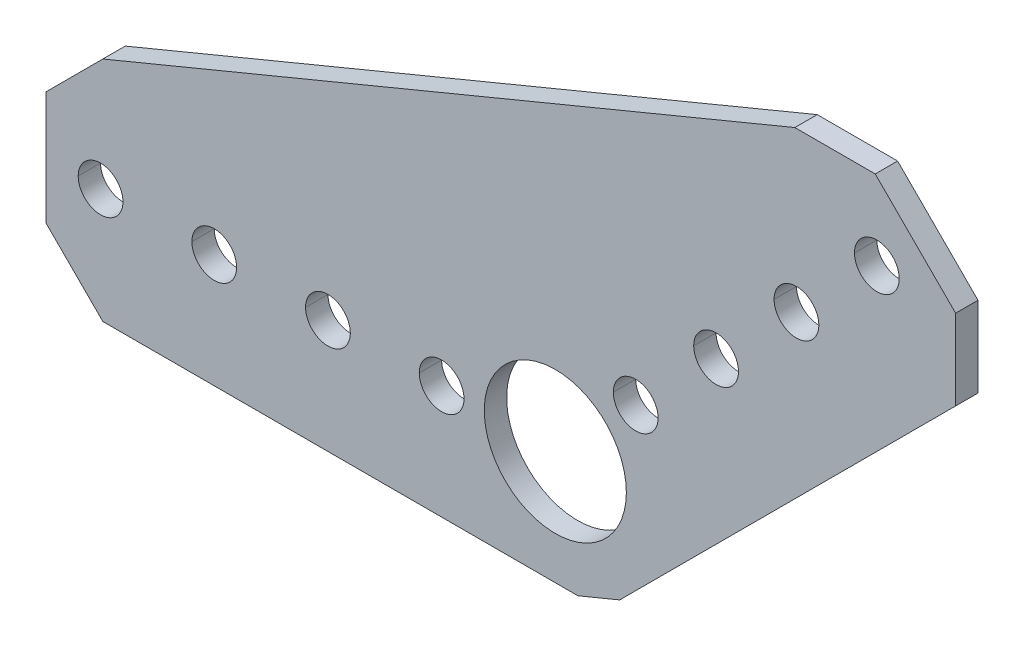
ISO-10303-21;
HEADER;
FILE_DESCRIPTION(('STEP AP214'),'2;1');
FILE_NAME('part.step','',(''),(''),'','','');
FILE_SCHEMA(('AUTOMOTIVE_DESIGN { 1 0 10303 214 1 1 1 1 }'));
ENDSEC;
DATA;
#1=APPLICATION_CONTEXT('core data for automotive mechanical design processes');
#2=APPLICATION_PROTOCOL_DEFINITION('international standard','automotive_design',2000,#1);
#3=PRODUCT_CONTEXT('',#1,'mechanical');
#4=PRODUCT('Part','Part','',(#3));
#5=PRODUCT_RELATED_PRODUCT_CATEGORY('part','',(#4));
#6=PRODUCT_DEFINITION_FORMATION('','',#4);
#7=PRODUCT_DEFINITION_CONTEXT('part definition',#1,'design');
#8=PRODUCT_DEFINITION('design','',#6,#7);
#9=PRODUCT_DEFINITION_SHAPE('','',#8);
#10=(LENGTH_UNIT() NAMED_UNIT(*) SI_UNIT(.MILLI.,.METRE.));
#11=(NAMED_UNIT(*) PLANE_ANGLE_UNIT() SI_UNIT($,.RADIAN.));
#12=(NAMED_UNIT(*) SI_UNIT($,.STERADIAN.) SOLID_ANGLE_UNIT());
#13=UNCERTAINTY_MEASURE_WITH_UNIT(LENGTH_MEASURE(1.E-05),#10,'distance_accuracy_value','');
#14=(GEOMETRIC_REPRESENTATION_CONTEXT(3) GLOBAL_UNCERTAINTY_ASSIGNED_CONTEXT((#13)) GLOBAL_UNIT_ASSIGNED_CONTEXT((#10,
#11,#12)) REPRESENTATION_CONTEXT('',''));
#15=CARTESIAN_POINT('',(0.,0.,0.));
#16=DIRECTION('',(0.,0.,1.));
#17=DIRECTION('',(1.,0.,0.));
#18=AXIS2_PLACEMENT_3D('',#15,#16,#17);
#19=CARTESIAN_POINT('',(-50.546,12.7,-84.9266705185577));
#20=DIRECTION('',(-0.382683432365091,0.923879532511286,0.));
#21=DIRECTION('',(0.,0.,1.));
#22=AXIS2_PLACEMENT_3D('',#19,#20,#21);
#23=PLANE('',#22);
#24=DIRECTION('',(0.923879532511286,0.382683432365091,0.));
#25=VECTOR('',#24,1.);
#26=CARTESIAN_POINT('',(-50.546,12.7,-1.25));
#27=LINE('',#26,#25);
#28=CARTESIAN_POINT('',(-50.546,12.7,-1.25));
#29=VERTEX_POINT('',#28);
#30=CARTESIAN_POINT('',(26.7611632407861,44.7216754829245,-1.25));
#31=VERTEX_POINT('',#30);
#32=EDGE_CURVE('E126',#29,#31,#27,.T.);
#33=ORIENTED_EDGE('',*,*,#32,.F.);
#34=DIRECTION('',(0.,0.,1.));
#35=VECTOR('',#34,1.);
#36=CARTESIAN_POINT('',(-50.546,12.7,1.25));
#37=LINE('',#36,#35);
#38=CARTESIAN_POINT('',(-50.546,12.7,1.25));
#39=VERTEX_POINT('',#38);
#40=EDGE_CURVE('E65',#29,#39,#37,.T.);
#41=ORIENTED_EDGE('',*,*,#40,.T.);
#42=DIRECTION('',(-0.923879532511286,-0.382683432365091,0.));
#43=VECTOR('',#42,1.);
#44=CARTESIAN_POINT('',(-50.546,12.7,1.25));
#45=LINE('',#44,#43);
#46=CARTESIAN_POINT('',(26.7611632407861,44.7216754829245,1.25));
#47=VERTEX_POINT('',#46);
#48=EDGE_CURVE('E123',#47,#39,#45,.T.);
#49=ORIENTED_EDGE('',*,*,#48,.F.);
#50=DIRECTION('',(0.,0.,-1.));
#51=VECTOR('',#50,1.);
#52=CARTESIAN_POINT('',(26.7611632407861,44.7216754829245,1.25));
#53=LINE('',#52,#51);
#54=EDGE_CURVE('E11',#47,#31,#53,.T.);
#55=ORIENTED_EDGE('',*,*,#54,.T.);
#56=EDGE_LOOP('',(#33,#41,#49,#55));
#57=FACE_BOUND('',#56,.T.);
#58=ADVANCED_FACE('F55',(#57),#23,.T.);
#59=CARTESIAN_POINT('',(44.7216754829243,35.7414193618553,1.25));
#60=DIRECTION('',(1.,0.,0.));
#61=DIRECTION('',(0.,1.,0.));
#62=AXIS2_PLACEMENT_3D('',#59,#60,#61);
#63=PLANE('',#62);
#64=DIRECTION('',(0.,1.,0.));
#65=VECTOR('',#64,1.);
#66=CARTESIAN_POINT('',(44.7216754829243,0.,1.25));
#67=LINE('',#66,#65);
#68=CARTESIAN_POINT('',(44.7216754829243,26.7611632407862,1.25));
#69=VERTEX_POINT('',#68);
#70=CARTESIAN_POINT('',(44.7216754829243,35.7414193618553,1.25));
#71=VERTEX_POINT('',#70);
#72=EDGE_CURVE('E182',#69,#71,#67,.T.);
#73=ORIENTED_EDGE('',*,*,#72,.F.);
#74=DIRECTION('',(0.,0.,1.));
#75=VECTOR('',#74,1.);
#76=CARTESIAN_POINT('',(44.7216754829243,26.7611632407862,1.25));
#77=LINE('',#76,#75);
#78=CARTESIAN_POINT('',(44.7216754829243,26.7611632407862,-1.25));
#79=VERTEX_POINT('',#78);
#80=EDGE_CURVE('E356',#79,#69,#77,.T.);
#81=ORIENTED_EDGE('',*,*,#80,.F.);
#82=DIRECTION('',(0.,-1.,0.));
#83=VECTOR('',#82,1.);
#84=CARTESIAN_POINT('',(44.7216754829243,35.7414193618553,-1.25));
#85=LINE('',#84,#83);
#86=CARTESIAN_POINT('',(44.7216754829243,35.7414193618553,-1.25));
#87=VERTEX_POINT('',#86);
#88=EDGE_CURVE('E195',#87,#79,#85,.T.);
#89=ORIENTED_EDGE('',*,*,#88,.F.);
#90=DIRECTION('',(0.,0.,-1.));
#91=VECTOR('',#90,1.);
#92=CARTESIAN_POINT('',(44.7216754829243,35.7414193618553,-1.25));
#93=LINE('',#92,#91);
#94=EDGE_CURVE('E166',#71,#87,#93,.T.);
#95=ORIENTED_EDGE('',*,*,#94,.F.);
#96=EDGE_LOOP('',(#73,#81,#89,#95));
#97=FACE_BOUND('',#96,.T.);
#98=ADVANCED_FACE('F529',(#97),#63,.T.);
#99=CARTESIAN_POINT('',(26.7611632407861,44.7216754829245,1.25));
#100=DIRECTION('',(0.,-1.,0.));
#101=DIRECTION('',(-1.,0.,0.));
#102=AXIS2_PLACEMENT_3D('',#99,#100,#101);
#103=PLANE('',#102);
#104=DIRECTION('',(-1.,0.,0.));
#105=VECTOR('',#104,1.);
#106=CARTESIAN_POINT('',(0.,44.7216754829245,1.25));
#107=LINE('',#106,#105);
#108=CARTESIAN_POINT('',(35.7414193618552,44.7216754829245,1.25));
#109=VERTEX_POINT('',#108);
#110=EDGE_CURVE('E147',#109,#47,#107,.T.);
#111=ORIENTED_EDGE('',*,*,#110,.F.);
#112=DIRECTION('',(0.,0.,1.));
#113=VECTOR('',#112,1.);
#114=CARTESIAN_POINT('',(35.7414193618552,44.7216754829245,1.25));
#115=LINE('',#114,#113);
#116=CARTESIAN_POINT('',(35.7414193618552,44.7216754829245,-1.25));
#117=VERTEX_POINT('',#116);
#118=EDGE_CURVE('E161',#117,#109,#115,.T.);
#119=ORIENTED_EDGE('',*,*,#118,.F.);
#120=DIRECTION('',(1.,0.,0.));
#121=VECTOR('',#120,1.);
#122=CARTESIAN_POINT('',(26.7611632407861,44.7216754829245,-1.25));
#123=LINE('',#122,#121);
#124=EDGE_CURVE('E192',#31,#117,#123,.T.);
#125=ORIENTED_EDGE('',*,*,#124,.F.);
#126=ORIENTED_EDGE('',*,*,#54,.F.);
#127=EDGE_LOOP('',(#111,#119,#125,#126));
#128=FACE_BOUND('',#127,.T.);
#129=ADVANCED_FACE('F534',(#128),#103,.F.);
#130=CARTESIAN_POINT('',(-56.896,6.35,1.25));
#131=DIRECTION('',(0.707106781186546,-0.707106781186549,0.));
#132=DIRECTION('',(0.,0.,-1.));
#133=AXIS2_PLACEMENT_3D('',#130,#131,#132);
#134=PLANE('',#133);
#135=DIRECTION('',(-0.707106781186549,-0.707106781186546,0.));
#136=VECTOR('',#135,1.);
#137=CARTESIAN_POINT('',(-31.623,31.623,1.25));
#138=LINE('',#137,#136);
#139=CARTESIAN_POINT('',(-56.896,6.35,1.25));
#140=VERTEX_POINT('',#139);
#141=EDGE_CURVE('E135',#39,#140,#138,.T.);
#142=ORIENTED_EDGE('',*,*,#141,.F.);
#143=ORIENTED_EDGE('',*,*,#40,.F.);
#144=DIRECTION('',(0.707106781186549,0.707106781186546,0.));
#145=VECTOR('',#144,1.);
#146=CARTESIAN_POINT('',(-56.896,6.35,-1.25));
#147=LINE('',#146,#145);
#148=CARTESIAN_POINT('',(-56.896,6.35,-1.25));
#149=VERTEX_POINT('',#148);
#150=EDGE_CURVE('E187',#149,#29,#147,.T.);
#151=ORIENTED_EDGE('',*,*,#150,.F.);
#152=DIRECTION('',(0.,0.,-1.));
#153=VECTOR('',#152,1.);
#154=CARTESIAN_POINT('',(-56.896,6.35,1.25));
#155=LINE('',#154,#153);
#156=EDGE_CURVE('E138',#140,#149,#155,.T.);
#157=ORIENTED_EDGE('',*,*,#156,.F.);
#158=EDGE_LOOP('',(#142,#143,#151,#157));
#159=FACE_BOUND('',#158,.T.);
#160=ADVANCED_FACE('F136',(#159),#134,.F.);
#161=CARTESIAN_POINT('',(-50.546,-12.7,1.25));
#162=DIRECTION('',(-0.70710678118655,-0.707106781186545,0.));
#163=DIRECTION('',(-0.707106781186545,0.70710678118655,0.));
#164=AXIS2_PLACEMENT_3D('',#161,#162,#163);
#165=PLANE('',#164);
#166=DIRECTION('',(0.707106781186545,-0.70710678118655,0.));
#167=VECTOR('',#166,1.);
#168=CARTESIAN_POINT('',(-31.623,-31.623,1.25));
#169=LINE('',#168,#167);
#170=CARTESIAN_POINT('',(-56.896,-6.35,1.25));
#171=VERTEX_POINT('',#170);
#172=CARTESIAN_POINT('',(-50.546,-12.7,1.25));
#173=VERTEX_POINT('',#172);
#174=EDGE_CURVE('E143',#171,#173,#169,.T.);
#175=ORIENTED_EDGE('',*,*,#174,.F.);
#176=DIRECTION('',(0.,0.,1.));
#177=VECTOR('',#176,1.);
#178=CARTESIAN_POINT('',(-56.896,-6.35,1.25));
#179=LINE('',#178,#177);
#180=CARTESIAN_POINT('',(-56.896,-6.35,-1.25));
#181=VERTEX_POINT('',#180);
#182=EDGE_CURVE('E174',#181,#171,#179,.T.);
#183=ORIENTED_EDGE('',*,*,#182,.F.);
#184=DIRECTION('',(-0.707106781186545,0.70710678118655,0.));
#185=VECTOR('',#184,1.);
#186=CARTESIAN_POINT('',(-50.546,-12.7,-1.25));
#187=LINE('',#186,#185);
#188=CARTESIAN_POINT('',(-50.546,-12.7,-1.25));
#189=VERTEX_POINT('',#188);
#190=EDGE_CURVE('E191',#189,#181,#187,.T.);
#191=ORIENTED_EDGE('',*,*,#190,.F.);
#192=DIRECTION('',(0.,0.,-1.));
#193=VECTOR('',#192,1.);
#194=CARTESIAN_POINT('',(-50.546,-12.7,-1.25));
#195=LINE('',#194,#193);
#196=EDGE_CURVE('E335',#173,#189,#195,.T.);
#197=ORIENTED_EDGE('',*,*,#196,.F.);
#198=EDGE_LOOP('',(#175,#183,#191,#197));
#199=FACE_BOUND('',#198,.T.);
#200=ADVANCED_FACE('F545',(#199),#165,.T.);
#201=CARTESIAN_POINT('',(8.9802561210692,8.98025612106911,1.25));
#202=DIRECTION('',(0.,0.,1.));
#203=DIRECTION('',(1.,0.,0.));
#204=AXIS2_PLACEMENT_3D('',#201,#202,#203);
#205=CYLINDRICAL_SURFACE('',#204,2.5);
#206=DIRECTION('',(0.,0.,1.));
#207=VECTOR('',#206,1.);
#208=CARTESIAN_POINT('',(6.48025612106921,8.98025612106911,1.25));
#209=LINE('',#208,#207);
#210=CARTESIAN_POINT('',(6.4802561210692,8.98025612106911,-1.25));
#211=VERTEX_POINT('',#210);
#212=CARTESIAN_POINT('',(6.48025612106921,8.98025612106911,1.25));
#213=VERTEX_POINT('',#212);
#214=EDGE_CURVE('E445',#211,#213,#209,.T.);
#215=ORIENTED_EDGE('',*,*,#214,.F.);
#216=CARTESIAN_POINT('',(8.9802561210692,8.98025612106911,-1.25));
#217=DIRECTION('',(0.,0.,1.));
#218=DIRECTION('',(1.,0.,0.));
#219=AXIS2_PLACEMENT_3D('',#216,#217,#218);
#220=CIRCLE('',#219,2.5);
#221=CARTESIAN_POINT('',(11.4802561210692,8.98025612106911,-1.25));
#222=VERTEX_POINT('',#221);
#223=EDGE_CURVE('E190',#222,#211,#220,.T.);
#224=ORIENTED_EDGE('',*,*,#223,.F.);
#225=DIRECTION('',(0.,0.,1.));
#226=VECTOR('',#225,1.);
#227=CARTESIAN_POINT('',(11.4802561210692,8.98025612106911,1.25));
#228=LINE('',#227,#226);
#229=CARTESIAN_POINT('',(11.4802561210692,8.98025612106911,1.25));
#230=VERTEX_POINT('',#229);
#231=EDGE_CURVE('E404',#222,#230,#228,.T.);
#232=ORIENTED_EDGE('',*,*,#231,.T.);
#233=CARTESIAN_POINT('',(8.9802561210692,8.98025612106911,1.25));
#234=DIRECTION('',(0.,0.,1.));
#235=DIRECTION('',(1.,0.,0.));
#236=AXIS2_PLACEMENT_3D('',#233,#234,#235);
#237=CIRCLE('',#236,2.5);
#238=EDGE_CURVE('E177',#230,#213,#237,.T.);
#239=ORIENTED_EDGE('',*,*,#238,.T.);
#240=EDGE_LOOP('',(#215,#224,#232,#239));
#241=FACE_BOUND('',#240,.T.);
#242=ADVANCED_FACE('F512',(#241),#205,.F.);
#243=CARTESIAN_POINT('',(17.9605122421383,17.9605122421383,1.25));
#244=DIRECTION('',(0.,0.,1.));
#245=DIRECTION('',(1.,0.,0.));
#246=AXIS2_PLACEMENT_3D('',#243,#244,#245);
#247=CYLINDRICAL_SURFACE('',#246,2.5);
#248=DIRECTION('',(0.,0.,1.));
#249=VECTOR('',#248,1.);
#250=CARTESIAN_POINT('',(15.4605122421383,17.9605122421383,1.25));
#251=LINE('',#250,#249);
#252=CARTESIAN_POINT('',(15.4605122421383,17.9605122421383,-1.25));
#253=VERTEX_POINT('',#252);
#254=CARTESIAN_POINT('',(15.4605122421383,17.9605122421383,1.25));
#255=VERTEX_POINT('',#254);
#256=EDGE_CURVE('E413',#253,#255,#251,.T.);
#257=ORIENTED_EDGE('',*,*,#256,.F.);
#258=CARTESIAN_POINT('',(17.9605122421383,17.9605122421383,-1.25));
#259=DIRECTION('',(0.,0.,1.));
#260=DIRECTION('',(1.,0.,0.));
#261=AXIS2_PLACEMENT_3D('',#258,#259,#260);
#262=CIRCLE('',#261,2.5);
#263=CARTESIAN_POINT('',(20.4605122421383,17.9605122421383,-1.25));
#264=VERTEX_POINT('',#263);
#265=EDGE_CURVE('E200',#264,#253,#262,.T.);
#266=ORIENTED_EDGE('',*,*,#265,.F.);
#267=DIRECTION('',(0.,0.,1.));
#268=VECTOR('',#267,1.);
#269=CARTESIAN_POINT('',(20.4605122421383,17.9605122421383,1.25));
#270=LINE('',#269,#268);
#271=CARTESIAN_POINT('',(20.4605122421383,17.9605122421383,1.25));
#272=VERTEX_POINT('',#271);
#273=EDGE_CURVE('E378',#264,#272,#270,.T.);
#274=ORIENTED_EDGE('',*,*,#273,.T.);
#275=CARTESIAN_POINT('',(17.9605122421383,17.9605122421383,1.25));
#276=DIRECTION('',(0.,0.,1.));
#277=DIRECTION('',(1.,0.,0.));
#278=AXIS2_PLACEMENT_3D('',#275,#276,#277);
#279=CIRCLE('',#278,2.5);
#280=EDGE_CURVE('E181',#272,#255,#279,.T.);
#281=ORIENTED_EDGE('',*,*,#280,.T.);
#282=EDGE_LOOP('',(#257,#266,#274,#281));
#283=FACE_BOUND('',#282,.T.);
#284=ADVANCED_FACE('F551',(#283),#247,.F.);
#285=CARTESIAN_POINT('',(26.9407683632075,26.9407683632075,1.25));
#286=DIRECTION('',(0.,0.,1.));
#287=DIRECTION('',(1.,0.,0.));
#288=AXIS2_PLACEMENT_3D('',#285,#286,#287);
#289=CYLINDRICAL_SURFACE('',#288,2.5);
#290=DIRECTION('',(0.,0.,1.));
#291=VECTOR('',#290,1.);
#292=CARTESIAN_POINT('',(24.4407683632075,26.9407683632075,1.25));
#293=LINE('',#292,#291);
#294=CARTESIAN_POINT('',(24.4407683632075,26.9407683632075,-1.25));
#295=VERTEX_POINT('',#294);
#296=CARTESIAN_POINT('',(24.4407683632075,26.9407683632075,1.25));
#297=VERTEX_POINT('',#296);
#298=EDGE_CURVE('E377',#295,#297,#293,.T.);
#299=ORIENTED_EDGE('',*,*,#298,.F.);
#300=CARTESIAN_POINT('',(26.9407683632075,26.9407683632075,-1.25));
#301=DIRECTION('',(0.,0.,1.));
#302=DIRECTION('',(1.,0.,0.));
#303=AXIS2_PLACEMENT_3D('',#300,#301,#302);
#304=CIRCLE('',#303,2.5);
#305=CARTESIAN_POINT('',(29.4407683632075,26.9407683632075,-1.25));
#306=VERTEX_POINT('',#305);
#307=EDGE_CURVE('E203',#306,#295,#304,.T.);
#308=ORIENTED_EDGE('',*,*,#307,.F.);
#309=DIRECTION('',(0.,0.,1.));
#310=VECTOR('',#309,1.);
#311=CARTESIAN_POINT('',(29.4407683632075,26.9407683632075,1.25));
#312=LINE('',#311,#310);
#313=CARTESIAN_POINT('',(29.4407683632075,26.9407683632075,1.25));
#314=VERTEX_POINT('',#313);
#315=EDGE_CURVE('E384',#306,#314,#312,.T.);
#316=ORIENTED_EDGE('',*,*,#315,.T.);
#317=CARTESIAN_POINT('',(26.9407683632075,26.9407683632075,1.25));
#318=DIRECTION('',(0.,0.,1.));
#319=DIRECTION('',(1.,0.,0.));
#320=AXIS2_PLACEMENT_3D('',#317,#318,#319);
#321=CIRCLE('',#320,2.5);
#322=EDGE_CURVE('E186',#314,#297,#321,.T.);
#323=ORIENTED_EDGE('',*,*,#322,.T.);
#324=EDGE_LOOP('',(#299,#308,#316,#323));
#325=FACE_BOUND('',#324,.T.);
#326=ADVANCED_FACE('F554',(#325),#289,.F.);
#327=CARTESIAN_POINT('',(35.9210244842766,35.9210244842766,1.25));
#328=DIRECTION('',(0.,0.,1.));
#329=DIRECTION('',(1.,0.,0.));
#330=AXIS2_PLACEMENT_3D('',#327,#328,#329);
#331=CYLINDRICAL_SURFACE('',#330,2.5);
#332=DIRECTION('',(0.,0.,1.));
#333=VECTOR('',#332,1.);
#334=CARTESIAN_POINT('',(33.4210244842766,35.9210244842766,1.25));
#335=LINE('',#334,#333);
#336=CARTESIAN_POINT('',(33.4210244842766,35.9210244842766,-1.25));
#337=VERTEX_POINT('',#336);
#338=CARTESIAN_POINT('',(33.4210244842766,35.9210244842766,1.25));
#339=VERTEX_POINT('',#338);
#340=EDGE_CURVE('E230',#337,#339,#335,.T.);
#341=ORIENTED_EDGE('',*,*,#340,.F.);
#342=CARTESIAN_POINT('',(35.9210244842766,35.9210244842766,-1.25));
#343=DIRECTION('',(0.,0.,1.));
#344=DIRECTION('',(1.,0.,0.));
#345=AXIS2_PLACEMENT_3D('',#342,#343,#344);
#346=CIRCLE('',#345,2.5);
#347=CARTESIAN_POINT('',(38.4210244842766,35.9210244842766,-1.25));
#348=VERTEX_POINT('',#347);
#349=EDGE_CURVE('E213',#348,#337,#346,.T.);
#350=ORIENTED_EDGE('',*,*,#349,.F.);
#351=DIRECTION('',(0.,0.,1.));
#352=VECTOR('',#351,1.);
#353=CARTESIAN_POINT('',(38.4210244842766,35.9210244842766,1.25));
#354=LINE('',#353,#352);
#355=CARTESIAN_POINT('',(38.4210244842766,35.9210244842766,1.25));
#356=VERTEX_POINT('',#355);
#357=EDGE_CURVE('E240',#348,#356,#354,.T.);
#358=ORIENTED_EDGE('',*,*,#357,.T.);
#359=CARTESIAN_POINT('',(35.9210244842766,35.9210244842766,1.25));
#360=DIRECTION('',(0.,0.,1.));
#361=DIRECTION('',(1.,0.,0.));
#362=AXIS2_PLACEMENT_3D('',#359,#360,#361);
#363=CIRCLE('',#362,2.5);
#364=EDGE_CURVE('E277',#356,#339,#363,.T.);
#365=ORIENTED_EDGE('',*,*,#364,.T.);
#366=EDGE_LOOP('',(#341,#350,#358,#365));
#367=FACE_BOUND('',#366,.T.);
#368=ADVANCED_FACE('F557',(#367),#331,.F.);
#369=CARTESIAN_POINT('',(-38.1,0.,1.25));
#370=DIRECTION('',(0.,0.,1.));
#371=DIRECTION('',(1.,0.,0.));
#372=AXIS2_PLACEMENT_3D('',#369,#370,#371);
#373=CYLINDRICAL_SURFACE('',#372,2.5);
#374=DIRECTION('',(0.,0.,1.));
#375=VECTOR('',#374,1.);
#376=CARTESIAN_POINT('',(-40.6,0.,1.25));
#377=LINE('',#376,#375);
#378=CARTESIAN_POINT('',(-40.6,0.,-1.25));
#379=VERTEX_POINT('',#378);
#380=CARTESIAN_POINT('',(-40.6,0.,1.25));
#381=VERTEX_POINT('',#380);
#382=EDGE_CURVE('E239',#379,#381,#377,.T.);
#383=ORIENTED_EDGE('',*,*,#382,.F.);
#384=CARTESIAN_POINT('',(-38.1,0.,-1.25));
#385=DIRECTION('',(0.,0.,1.));
#386=DIRECTION('',(1.,0.,0.));
#387=AXIS2_PLACEMENT_3D('',#384,#385,#386);
#388=CIRCLE('',#387,2.5);
#389=CARTESIAN_POINT('',(-35.6,0.,-1.25));
#390=VERTEX_POINT('',#389);
#391=EDGE_CURVE('E58',#390,#379,#388,.T.);
#392=ORIENTED_EDGE('',*,*,#391,.F.);
#393=DIRECTION('',(0.,0.,1.));
#394=VECTOR('',#393,1.);
#395=CARTESIAN_POINT('',(-35.6,0.,1.25));
#396=LINE('',#395,#394);
#397=CARTESIAN_POINT('',(-35.6,0.,1.25));
#398=VERTEX_POINT('',#397);
#399=EDGE_CURVE('E248',#390,#398,#396,.T.);
#400=ORIENTED_EDGE('',*,*,#399,.T.);
#401=CARTESIAN_POINT('',(-38.1,0.,1.25));
#402=DIRECTION('',(0.,0.,1.));
#403=DIRECTION('',(1.,0.,0.));
#404=AXIS2_PLACEMENT_3D('',#401,#402,#403);
#405=CIRCLE('',#404,2.5);
#406=EDGE_CURVE('E272',#398,#381,#405,.T.);
#407=ORIENTED_EDGE('',*,*,#406,.T.);
#408=EDGE_LOOP('',(#383,#392,#400,#407));
#409=FACE_BOUND('',#408,.T.);
#410=ADVANCED_FACE('F560',(#409),#373,.F.);
#411=CARTESIAN_POINT('',(-50.8,0.,1.25));
#412=DIRECTION('',(0.,0.,1.));
#413=DIRECTION('',(1.,0.,0.));
#414=AXIS2_PLACEMENT_3D('',#411,#412,#413);
#415=CYLINDRICAL_SURFACE('',#414,2.5);
#416=DIRECTION('',(0.,0.,1.));
#417=VECTOR('',#416,1.);
#418=CARTESIAN_POINT('',(-53.3,0.,1.25));
#419=LINE('',#418,#417);
#420=CARTESIAN_POINT('',(-53.3,0.,-1.25));
#421=VERTEX_POINT('',#420);
#422=CARTESIAN_POINT('',(-53.3,0.,1.25));
#423=VERTEX_POINT('',#422);
#424=EDGE_CURVE('E256',#421,#423,#419,.T.);
#425=ORIENTED_EDGE('',*,*,#424,.F.);
#426=CARTESIAN_POINT('',(-50.8,0.,-1.25));
#427=DIRECTION('',(0.,0.,1.));
#428=DIRECTION('',(1.,0.,0.));
#429=AXIS2_PLACEMENT_3D('',#426,#427,#428);
#430=CIRCLE('',#429,2.5);
#431=CARTESIAN_POINT('',(-48.3,0.,-1.25));
#432=VERTEX_POINT('',#431);
#433=EDGE_CURVE('E131',#432,#421,#430,.T.);
#434=ORIENTED_EDGE('',*,*,#433,.F.);
#435=DIRECTION('',(0.,0.,1.));
#436=VECTOR('',#435,1.);
#437=CARTESIAN_POINT('',(-48.3,0.,1.25));
#438=LINE('',#437,#436);
#439=CARTESIAN_POINT('',(-48.3,0.,1.25));
#440=VERTEX_POINT('',#439);
#441=EDGE_CURVE('E267',#432,#440,#438,.T.);
#442=ORIENTED_EDGE('',*,*,#441,.T.);
#443=CARTESIAN_POINT('',(-50.8,0.,1.25));
#444=DIRECTION('',(0.,0.,1.));
#445=DIRECTION('',(1.,0.,0.));
#446=AXIS2_PLACEMENT_3D('',#443,#444,#445);
#447=CIRCLE('',#446,2.5);
#448=EDGE_CURVE('E276',#440,#423,#447,.T.);
#449=ORIENTED_EDGE('',*,*,#448,.T.);
#450=EDGE_LOOP('',(#425,#434,#442,#449));
#451=FACE_BOUND('',#450,.T.);
#452=ADVANCED_FACE('F564',(#451),#415,.F.);
#453=CARTESIAN_POINT('',(0.,0.,-1.25));
#454=DIRECTION('',(0.,0.,1.));
#455=DIRECTION('',(1.,0.,0.));
#456=AXIS2_PLACEMENT_3D('',#453,#454,#455);
#457=PLANE('',#456);
#458=CARTESIAN_POINT('',(0.,0.,-1.25));
#459=DIRECTION('',(0.,0.,1.));
#460=DIRECTION('',(1.,0.,0.));
#461=AXIS2_PLACEMENT_3D('',#458,#459,#460);
#462=CIRCLE('',#461,7.9375);
#463=CARTESIAN_POINT('',(7.9375,0.,-1.25));
#464=VERTEX_POINT('',#463);
#465=EDGE_CURVE('E456',#464,#464,#462,.T.);
#466=ORIENTED_EDGE('',*,*,#465,.T.);
#467=EDGE_LOOP('',(#466));
#468=FACE_BOUND('',#467,.T.);
#469=CARTESIAN_POINT('',(-12.7,0.,-1.25));
#470=DIRECTION('',(0.,0.,1.));
#471=DIRECTION('',(1.,0.,0.));
#472=AXIS2_PLACEMENT_3D('',#469,#470,#471);
#473=CIRCLE('',#472,2.5);
#474=CARTESIAN_POINT('',(-10.2,0.,-1.25));
#475=VERTEX_POINT('',#474);
#476=CARTESIAN_POINT('',(-15.2,0.,-1.25));
#477=VERTEX_POINT('',#476);
#478=EDGE_CURVE('E311',#475,#477,#473,.T.);
#479=ORIENTED_EDGE('',*,*,#478,.T.);
#480=CARTESIAN_POINT('',(-12.7,0.,-1.25));
#481=DIRECTION('',(0.,0.,1.));
#482=DIRECTION('',(1.,0.,0.));
#483=AXIS2_PLACEMENT_3D('',#480,#481,#482);
#484=CIRCLE('',#483,2.5);
#485=EDGE_CURVE('E290',#477,#475,#484,.T.);
#486=ORIENTED_EDGE('',*,*,#485,.T.);
#487=EDGE_LOOP('',(#479,#486));
#488=FACE_BOUND('',#487,.T.);
#489=CARTESIAN_POINT('',(-25.4,0.,-1.25));
#490=DIRECTION('',(0.,0.,1.));
#491=DIRECTION('',(1.,0.,0.));
#492=AXIS2_PLACEMENT_3D('',#489,#490,#491);
#493=CIRCLE('',#492,2.5);
#494=CARTESIAN_POINT('',(-22.9,0.,-1.25));
#495=VERTEX_POINT('',#494);
#496=CARTESIAN_POINT('',(-27.9,0.,-1.25));
#497=VERTEX_POINT('',#496);
#498=EDGE_CURVE('E326',#495,#497,#493,.T.);
#499=ORIENTED_EDGE('',*,*,#498,.T.);
#500=CARTESIAN_POINT('',(-25.4,0.,-1.25));
#501=DIRECTION('',(0.,0.,1.));
#502=DIRECTION('',(1.,0.,0.));
#503=AXIS2_PLACEMENT_3D('',#500,#501,#502);
#504=CIRCLE('',#503,2.5);
#505=EDGE_CURVE('E270',#497,#495,#504,.T.);
#506=ORIENTED_EDGE('',*,*,#505,.T.);
#507=EDGE_LOOP('',(#499,#506));
#508=FACE_BOUND('',#507,.T.);
#509=ORIENTED_EDGE('',*,*,#433,.T.);
#510=CARTESIAN_POINT('',(-50.8,0.,-1.25));
#511=DIRECTION('',(0.,0.,1.));
#512=DIRECTION('',(1.,0.,0.));
#513=AXIS2_PLACEMENT_3D('',#510,#511,#512);
#514=CIRCLE('',#513,2.5);
#515=EDGE_CURVE('E252',#421,#432,#514,.T.);
#516=ORIENTED_EDGE('',*,*,#515,.T.);
#517=EDGE_LOOP('',(#509,#516));
#518=FACE_BOUND('',#517,.T.);
#519=ORIENTED_EDGE('',*,*,#391,.T.);
#520=CARTESIAN_POINT('',(-38.1,0.,-1.25));
#521=DIRECTION('',(0.,0.,1.));
#522=DIRECTION('',(1.,0.,0.));
#523=AXIS2_PLACEMENT_3D('',#520,#521,#522);
#524=CIRCLE('',#523,2.5);
#525=EDGE_CURVE('E235',#379,#390,#524,.T.);
#526=ORIENTED_EDGE('',*,*,#525,.T.);
#527=EDGE_LOOP('',(#519,#526));
#528=FACE_BOUND('',#527,.T.);
#529=ORIENTED_EDGE('',*,*,#349,.T.);
#530=CARTESIAN_POINT('',(35.9210244842766,35.9210244842766,-1.25));
#531=DIRECTION('',(0.,0.,1.));
#532=DIRECTION('',(1.,0.,0.));
#533=AXIS2_PLACEMENT_3D('',#530,#531,#532);
#534=CIRCLE('',#533,2.5);
#535=EDGE_CURVE('E225',#337,#348,#534,.T.);
#536=ORIENTED_EDGE('',*,*,#535,.T.);
#537=EDGE_LOOP('',(#529,#536));
#538=FACE_BOUND('',#537,.T.);
#539=ORIENTED_EDGE('',*,*,#307,.T.);
#540=CARTESIAN_POINT('',(26.9407683632075,26.9407683632075,-1.25));
#541=DIRECTION('',(0.,0.,1.));
#542=DIRECTION('',(1.,0.,0.));
#543=AXIS2_PLACEMENT_3D('',#540,#541,#542);
#544=CIRCLE('',#543,2.5);
#545=EDGE_CURVE('E373',#295,#306,#544,.T.);
#546=ORIENTED_EDGE('',*,*,#545,.T.);
#547=EDGE_LOOP('',(#539,#546));
#548=FACE_BOUND('',#547,.T.);
#549=ORIENTED_EDGE('',*,*,#265,.T.);
#550=CARTESIAN_POINT('',(17.9605122421383,17.9605122421383,-1.25));
#551=DIRECTION('',(0.,0.,1.));
#552=DIRECTION('',(1.,0.,0.));
#553=AXIS2_PLACEMENT_3D('',#550,#551,#552);
#554=CIRCLE('',#553,2.5);
#555=EDGE_CURVE('E408',#253,#264,#554,.T.);
#556=ORIENTED_EDGE('',*,*,#555,.T.);
#557=EDGE_LOOP('',(#549,#556));
#558=FACE_BOUND('',#557,.T.);
#559=ORIENTED_EDGE('',*,*,#223,.T.);
#560=CARTESIAN_POINT('',(8.9802561210692,8.98025612106911,-1.25));
#561=DIRECTION('',(0.,0.,1.));
#562=DIRECTION('',(1.,0.,0.));
#563=AXIS2_PLACEMENT_3D('',#560,#561,#562);
#564=CIRCLE('',#563,2.5);
#565=EDGE_CURVE('E448',#211,#222,#564,.T.);
#566=ORIENTED_EDGE('',*,*,#565,.T.);
#567=EDGE_LOOP('',(#559,#566));
#568=FACE_BOUND('',#567,.T.);
#569=ORIENTED_EDGE('',*,*,#32,.T.);
#570=ORIENTED_EDGE('',*,*,#124,.T.);
#571=DIRECTION('',(0.707106781186549,-0.707106781186547,0.));
#572=VECTOR('',#571,1.);
#573=CARTESIAN_POINT('',(40.2315474223897,40.2315474223899,-1.25));
#574=LINE('',#573,#572);
#575=EDGE_CURVE('E157',#117,#87,#574,.T.);
#576=ORIENTED_EDGE('',*,*,#575,.T.);
#577=ORIENTED_EDGE('',*,*,#88,.T.);
#578=DIRECTION('',(0.707106781186546,0.707106781186549,0.));
#579=VECTOR('',#578,1.);
#580=CARTESIAN_POINT('',(8.98025612106917,-8.98025612106913,-1.25));
#581=LINE('',#580,#579);
#582=CARTESIAN_POINT('',(7.19397211635163,-10.7665401257867,-1.25));
#583=VERTEX_POINT('',#582);
#584=EDGE_CURVE('E354',#583,#79,#581,.T.);
#585=ORIENTED_EDGE('',*,*,#584,.F.);
#586=DIRECTION('',(0.923879532511287,0.382683432365091,0.));
#587=VECTOR('',#586,1.);
#588=CARTESIAN_POINT('',(4.86007959103664,-11.7332700628933,-1.25));
#589=LINE('',#588,#587);
#590=CARTESIAN_POINT('',(2.52618706572165,-12.7,-1.25));
#591=VERTEX_POINT('',#590);
#592=EDGE_CURVE('E347',#591,#583,#589,.T.);
#593=ORIENTED_EDGE('',*,*,#592,.F.);
#594=DIRECTION('',(1.,0.,0.));
#595=VECTOR('',#594,1.);
#596=CARTESIAN_POINT('',(0.,-12.7,-1.25));
#597=LINE('',#596,#595);
#598=EDGE_CURVE('E339',#189,#591,#597,.T.);
#599=ORIENTED_EDGE('',*,*,#598,.F.);
#600=ORIENTED_EDGE('',*,*,#190,.T.);
#601=DIRECTION('',(0.,1.,0.));
#602=VECTOR('',#601,1.);
#603=CARTESIAN_POINT('',(-56.896,0.,-1.25));
#604=LINE('',#603,#602);
#605=EDGE_CURVE('E170',#181,#149,#604,.T.);
#606=ORIENTED_EDGE('',*,*,#605,.T.);
#607=ORIENTED_EDGE('',*,*,#150,.T.);
#608=EDGE_LOOP('',(#569,#570,#576,#577,#585,#593,#599,#600,#606,#607));
#609=FACE_BOUND('',#608,.T.);
#610=ADVANCED_FACE('F479',(#468,#488,#508,#518,#528,#538,#548,#558,#568,#609),#457,.F.);
#611=CARTESIAN_POINT('',(0.,0.,1.25));
#612=DIRECTION('',(0.,0.,1.));
#613=DIRECTION('',(1.,0.,0.));
#614=AXIS2_PLACEMENT_3D('',#611,#612,#613);
#615=PLANE('',#614);
#616=CARTESIAN_POINT('',(0.,0.,1.25));
#617=DIRECTION('',(0.,0.,1.));
#618=DIRECTION('',(1.,0.,0.));
#619=AXIS2_PLACEMENT_3D('',#616,#617,#618);
#620=CIRCLE('',#619,7.9375);
#621=CARTESIAN_POINT('',(7.9375,0.,1.25));
#622=VERTEX_POINT('',#621);
#623=EDGE_CURVE('E461',#622,#622,#620,.T.);
#624=ORIENTED_EDGE('',*,*,#623,.F.);
#625=EDGE_LOOP('',(#624));
#626=FACE_BOUND('',#625,.T.);
#627=CARTESIAN_POINT('',(-12.7,0.,1.25));
#628=DIRECTION('',(0.,0.,1.));
#629=DIRECTION('',(1.,0.,0.));
#630=AXIS2_PLACEMENT_3D('',#627,#628,#629);
#631=CIRCLE('',#630,2.5);
#632=CARTESIAN_POINT('',(-10.2,0.,1.25));
#633=VERTEX_POINT('',#632);
#634=CARTESIAN_POINT('',(-15.2,0.,1.25));
#635=VERTEX_POINT('',#634);
#636=EDGE_CURVE('E315',#633,#635,#631,.T.);
#637=ORIENTED_EDGE('',*,*,#636,.F.);
#638=CARTESIAN_POINT('',(-12.7,0.,1.25));
#639=DIRECTION('',(0.,0.,1.));
#640=DIRECTION('',(1.,0.,0.));
#641=AXIS2_PLACEMENT_3D('',#638,#639,#640);
#642=CIRCLE('',#641,2.5);
#643=EDGE_CURVE('E289',#635,#633,#642,.T.);
#644=ORIENTED_EDGE('',*,*,#643,.F.);
#645=EDGE_LOOP('',(#637,#644));
#646=FACE_BOUND('',#645,.T.);
#647=CARTESIAN_POINT('',(-25.4,0.,1.25));
#648=DIRECTION('',(0.,0.,1.));
#649=DIRECTION('',(1.,0.,0.));
#650=AXIS2_PLACEMENT_3D('',#647,#648,#649);
#651=CIRCLE('',#650,2.5);
#652=CARTESIAN_POINT('',(-22.9,0.,1.25));
#653=VERTEX_POINT('',#652);
#654=CARTESIAN_POINT('',(-27.9,0.,1.25));
#655=VERTEX_POINT('',#654);
#656=EDGE_CURVE('E327',#653,#655,#651,.T.);
#657=ORIENTED_EDGE('',*,*,#656,.F.);
#658=CARTESIAN_POINT('',(-25.4,0.,1.25));
#659=DIRECTION('',(0.,0.,1.));
#660=DIRECTION('',(1.,0.,0.));
#661=AXIS2_PLACEMENT_3D('',#658,#659,#660);
#662=CIRCLE('',#661,2.5);
#663=EDGE_CURVE('E291',#655,#653,#662,.T.);
#664=ORIENTED_EDGE('',*,*,#663,.F.);
#665=EDGE_LOOP('',(#657,#664));
#666=FACE_BOUND('',#665,.T.);
#667=ORIENTED_EDGE('',*,*,#448,.F.);
#668=CARTESIAN_POINT('',(-50.8,0.,1.25));
#669=DIRECTION('',(0.,0.,1.));
#670=DIRECTION('',(1.,0.,0.));
#671=AXIS2_PLACEMENT_3D('',#668,#669,#670);
#672=CIRCLE('',#671,2.5);
#673=EDGE_CURVE('E263',#423,#440,#672,.T.);
#674=ORIENTED_EDGE('',*,*,#673,.F.);
#675=EDGE_LOOP('',(#667,#674));
#676=FACE_BOUND('',#675,.T.);
#677=ORIENTED_EDGE('',*,*,#406,.F.);
#678=CARTESIAN_POINT('',(-38.1,0.,1.25));
#679=DIRECTION('',(0.,0.,1.));
#680=DIRECTION('',(1.,0.,0.));
#681=AXIS2_PLACEMENT_3D('',#678,#679,#680);
#682=CIRCLE('',#681,2.5);
#683=EDGE_CURVE('E244',#381,#398,#682,.T.);
#684=ORIENTED_EDGE('',*,*,#683,.F.);
#685=EDGE_LOOP('',(#677,#684));
#686=FACE_BOUND('',#685,.T.);
#687=ORIENTED_EDGE('',*,*,#364,.F.);
#688=CARTESIAN_POINT('',(35.9210244842766,35.9210244842766,1.25));
#689=DIRECTION('',(0.,0.,1.));
#690=DIRECTION('',(1.,0.,0.));
#691=AXIS2_PLACEMENT_3D('',#688,#689,#690);
#692=CIRCLE('',#691,2.5);
#693=EDGE_CURVE('E234',#339,#356,#692,.T.);
#694=ORIENTED_EDGE('',*,*,#693,.F.);
#695=EDGE_LOOP('',(#687,#694));
#696=FACE_BOUND('',#695,.T.);
#697=ORIENTED_EDGE('',*,*,#322,.F.);
#698=CARTESIAN_POINT('',(26.9407683632075,26.9407683632075,1.25));
#699=DIRECTION('',(0.,0.,1.));
#700=DIRECTION('',(1.,0.,0.));
#701=AXIS2_PLACEMENT_3D('',#698,#699,#700);
#702=CIRCLE('',#701,2.5);
#703=EDGE_CURVE('E381',#297,#314,#702,.T.);
#704=ORIENTED_EDGE('',*,*,#703,.F.);
#705=EDGE_LOOP('',(#697,#704));
#706=FACE_BOUND('',#705,.T.);
#707=ORIENTED_EDGE('',*,*,#280,.F.);
#708=CARTESIAN_POINT('',(17.9605122421383,17.9605122421383,1.25));
#709=DIRECTION('',(0.,0.,1.));
#710=DIRECTION('',(1.,0.,0.));
#711=AXIS2_PLACEMENT_3D('',#708,#709,#710);
#712=CIRCLE('',#711,2.5);
#713=EDGE_CURVE('E420',#255,#272,#712,.T.);
#714=ORIENTED_EDGE('',*,*,#713,.F.);
#715=EDGE_LOOP('',(#707,#714));
#716=FACE_BOUND('',#715,.T.);
#717=ORIENTED_EDGE('',*,*,#238,.F.);
#718=CARTESIAN_POINT('',(8.9802561210692,8.98025612106911,1.25));
#719=DIRECTION('',(0.,0.,1.));
#720=DIRECTION('',(1.,0.,0.));
#721=AXIS2_PLACEMENT_3D('',#718,#719,#720);
#722=CIRCLE('',#721,2.5);
#723=EDGE_CURVE('E399',#213,#230,#722,.T.);
#724=ORIENTED_EDGE('',*,*,#723,.F.);
#725=EDGE_LOOP('',(#717,#724));
#726=FACE_BOUND('',#725,.T.);
#727=ORIENTED_EDGE('',*,*,#110,.T.);
#728=ORIENTED_EDGE('',*,*,#48,.T.);
#729=ORIENTED_EDGE('',*,*,#141,.T.);
#730=DIRECTION('',(0.,1.,0.));
#731=VECTOR('',#730,1.);
#732=CARTESIAN_POINT('',(-56.896,0.,1.25));
#733=LINE('',#732,#731);
#734=EDGE_CURVE('E171',#171,#140,#733,.T.);
#735=ORIENTED_EDGE('',*,*,#734,.F.);
#736=ORIENTED_EDGE('',*,*,#174,.T.);
#737=DIRECTION('',(1.,0.,0.));
#738=VECTOR('',#737,1.);
#739=CARTESIAN_POINT('',(0.,-12.7,1.25));
#740=LINE('',#739,#738);
#741=CARTESIAN_POINT('',(2.52618706572165,-12.7,1.25));
#742=VERTEX_POINT('',#741);
#743=EDGE_CURVE('E331',#173,#742,#740,.T.);
#744=ORIENTED_EDGE('',*,*,#743,.T.);
#745=DIRECTION('',(0.923879532511287,0.382683432365091,0.));
#746=VECTOR('',#745,1.);
#747=CARTESIAN_POINT('',(4.86007959103664,-11.7332700628933,1.25));
#748=LINE('',#747,#746);
#749=CARTESIAN_POINT('',(7.19397211635163,-10.7665401257867,1.25));
#750=VERTEX_POINT('',#749);
#751=EDGE_CURVE('E351',#742,#750,#748,.T.);
#752=ORIENTED_EDGE('',*,*,#751,.T.);
#753=DIRECTION('',(0.707106781186546,0.707106781186549,0.));
#754=VECTOR('',#753,1.);
#755=CARTESIAN_POINT('',(8.98025612106917,-8.98025612106913,1.25));
#756=LINE('',#755,#754);
#757=EDGE_CURVE('E155',#750,#69,#756,.T.);
#758=ORIENTED_EDGE('',*,*,#757,.T.);
#759=ORIENTED_EDGE('',*,*,#72,.T.);
#760=DIRECTION('',(0.707106781186549,-0.707106781186547,0.));
#761=VECTOR('',#760,1.);
#762=CARTESIAN_POINT('',(40.2315474223897,40.2315474223899,1.25));
#763=LINE('',#762,#761);
#764=EDGE_CURVE('E162',#109,#71,#763,.T.);
#765=ORIENTED_EDGE('',*,*,#764,.F.);
#766=EDGE_LOOP('',(#727,#728,#729,#735,#736,#744,#752,#758,#759,#765));
#767=FACE_BOUND('',#766,.T.);
#768=ADVANCED_FACE('F145',(#626,#646,#666,#676,#686,#696,#706,#716,#726,#767),#615,.T.);
#769=CARTESIAN_POINT('',(-56.896,0.,1.25));
#770=DIRECTION('',(-1.,0.,0.));
#771=DIRECTION('',(0.,0.,1.));
#772=AXIS2_PLACEMENT_3D('',#769,#770,#771);
#773=PLANE('',#772);
#774=ORIENTED_EDGE('',*,*,#605,.F.);
#775=ORIENTED_EDGE('',*,*,#182,.T.);
#776=ORIENTED_EDGE('',*,*,#734,.T.);
#777=ORIENTED_EDGE('',*,*,#156,.T.);
#778=EDGE_LOOP('',(#774,#775,#776,#777));
#779=FACE_BOUND('',#778,.T.);
#780=ADVANCED_FACE('F478',(#779),#773,.T.);
#781=CARTESIAN_POINT('',(40.2315474223897,40.2315474223899,1.25));
#782=DIRECTION('',(0.707106781186546,0.707106781186549,0.));
#783=DIRECTION('',(0.,0.,-1.));
#784=AXIS2_PLACEMENT_3D('',#781,#782,#783);
#785=PLANE('',#784);
#786=ORIENTED_EDGE('',*,*,#575,.F.);
#787=ORIENTED_EDGE('',*,*,#118,.T.);
#788=ORIENTED_EDGE('',*,*,#764,.T.);
#789=ORIENTED_EDGE('',*,*,#94,.T.);
#790=EDGE_LOOP('',(#786,#787,#788,#789));
#791=FACE_BOUND('',#790,.T.);
#792=ADVANCED_FACE('F574',(#791),#785,.T.);
#793=CARTESIAN_POINT('',(8.98025612106917,-8.98025612106913,1.25));
#794=DIRECTION('',(-0.707106781186549,0.707106781186546,0.));
#795=DIRECTION('',(0.,0.,1.));
#796=AXIS2_PLACEMENT_3D('',#793,#794,#795);
#797=PLANE('',#796);
#798=ORIENTED_EDGE('',*,*,#584,.T.);
#799=ORIENTED_EDGE('',*,*,#80,.T.);
#800=ORIENTED_EDGE('',*,*,#757,.F.);
#801=DIRECTION('',(0.,0.,-1.));
#802=VECTOR('',#801,1.);
#803=CARTESIAN_POINT('',(7.19397211635163,-10.7665401257867,1.25));
#804=LINE('',#803,#802);
#805=EDGE_CURVE('E355',#750,#583,#804,.T.);
#806=ORIENTED_EDGE('',*,*,#805,.T.);
#807=EDGE_LOOP('',(#798,#799,#800,#806));
#808=FACE_BOUND('',#807,.T.);
#809=ADVANCED_FACE('F576',(#808),#797,.F.);
#810=CARTESIAN_POINT('',(4.86007959103664,-11.7332700628933,1.25));
#811=DIRECTION('',(-0.38268343236509,0.923879532511287,0.));
#812=DIRECTION('',(0.,0.,1.));
#813=AXIS2_PLACEMENT_3D('',#810,#811,#812);
#814=PLANE('',#813);
#815=ORIENTED_EDGE('',*,*,#592,.T.);
#816=ORIENTED_EDGE('',*,*,#805,.F.);
#817=ORIENTED_EDGE('',*,*,#751,.F.);
#818=DIRECTION('',(0.,0.,-1.));
#819=VECTOR('',#818,1.);
#820=CARTESIAN_POINT('',(2.52618706572165,-12.7,1.25));
#821=LINE('',#820,#819);
#822=EDGE_CURVE('E343',#742,#591,#821,.T.);
#823=ORIENTED_EDGE('',*,*,#822,.T.);
#824=EDGE_LOOP('',(#815,#816,#817,#823));
#825=FACE_BOUND('',#824,.T.);
#826=ADVANCED_FACE('F579',(#825),#814,.F.);
#827=CARTESIAN_POINT('',(0.,-12.7,1.25));
#828=DIRECTION('',(0.,1.,0.));
#829=DIRECTION('',(1.,0.,0.));
#830=AXIS2_PLACEMENT_3D('',#827,#828,#829);
#831=PLANE('',#830);
#832=ORIENTED_EDGE('',*,*,#743,.F.);
#833=ORIENTED_EDGE('',*,*,#196,.T.);
#834=ORIENTED_EDGE('',*,*,#598,.T.);
#835=ORIENTED_EDGE('',*,*,#822,.F.);
#836=EDGE_LOOP('',(#832,#833,#834,#835));
#837=FACE_BOUND('',#836,.T.);
#838=ADVANCED_FACE('F580',(#837),#831,.F.);
#839=CARTESIAN_POINT('',(-25.4,0.,1.25));
#840=DIRECTION('',(0.,0.,1.));
#841=DIRECTION('',(1.,0.,0.));
#842=AXIS2_PLACEMENT_3D('',#839,#840,#841);
#843=CYLINDRICAL_SURFACE('',#842,2.5);
#844=DIRECTION('',(0.,0.,1.));
#845=VECTOR('',#844,1.);
#846=CARTESIAN_POINT('',(-27.9,0.,1.25));
#847=LINE('',#846,#845);
#848=EDGE_CURVE('E284',#497,#655,#847,.T.);
#849=ORIENTED_EDGE('',*,*,#848,.F.);
#850=ORIENTED_EDGE('',*,*,#498,.F.);
#851=DIRECTION('',(0.,0.,1.));
#852=VECTOR('',#851,1.);
#853=CARTESIAN_POINT('',(-22.9,0.,1.25));
#854=LINE('',#853,#852);
#855=EDGE_CURVE('E295',#495,#653,#854,.T.);
#856=ORIENTED_EDGE('',*,*,#855,.T.);
#857=ORIENTED_EDGE('',*,*,#656,.T.);
#858=EDGE_LOOP('',(#849,#850,#856,#857));
#859=FACE_BOUND('',#858,.T.);
#860=ADVANCED_FACE('F583',(#859),#843,.F.);
#861=CARTESIAN_POINT('',(-12.7,0.,1.25));
#862=DIRECTION('',(0.,0.,1.));
#863=DIRECTION('',(1.,0.,0.));
#864=AXIS2_PLACEMENT_3D('',#861,#862,#863);
#865=CYLINDRICAL_SURFACE('',#864,2.5);
#866=DIRECTION('',(0.,0.,1.));
#867=VECTOR('',#866,1.);
#868=CARTESIAN_POINT('',(-15.2,0.,1.25));
#869=LINE('',#868,#867);
#870=EDGE_CURVE('E285',#477,#635,#869,.T.);
#871=ORIENTED_EDGE('',*,*,#870,.F.);
#872=ORIENTED_EDGE('',*,*,#478,.F.);
#873=DIRECTION('',(0.,0.,1.));
#874=VECTOR('',#873,1.);
#875=CARTESIAN_POINT('',(-10.2,0.,1.25));
#876=LINE('',#875,#874);
#877=EDGE_CURVE('E316',#475,#633,#876,.T.);
#878=ORIENTED_EDGE('',*,*,#877,.T.);
#879=ORIENTED_EDGE('',*,*,#636,.T.);
#880=EDGE_LOOP('',(#871,#872,#878,#879));
#881=FACE_BOUND('',#880,.T.);
#882=ADVANCED_FACE('F585',(#881),#865,.F.);
#883=CARTESIAN_POINT('',(-12.7,0.,1.25));
#884=DIRECTION('',(0.,0.,1.));
#885=DIRECTION('',(1.,0.,0.));
#886=AXIS2_PLACEMENT_3D('',#883,#884,#885);
#887=CYLINDRICAL_SURFACE('',#886,2.5);
#888=ORIENTED_EDGE('',*,*,#485,.F.);
#889=ORIENTED_EDGE('',*,*,#870,.T.);
#890=ORIENTED_EDGE('',*,*,#643,.T.);
#891=ORIENTED_EDGE('',*,*,#877,.F.);
#892=EDGE_LOOP('',(#888,#889,#890,#891));
#893=FACE_BOUND('',#892,.T.);
#894=ADVANCED_FACE('F588',(#893),#887,.F.);
#895=CARTESIAN_POINT('',(-25.4,0.,1.25));
#896=DIRECTION('',(0.,0.,1.));
#897=DIRECTION('',(1.,0.,0.));
#898=AXIS2_PLACEMENT_3D('',#895,#896,#897);
#899=CYLINDRICAL_SURFACE('',#898,2.5);
#900=ORIENTED_EDGE('',*,*,#505,.F.);
#901=ORIENTED_EDGE('',*,*,#848,.T.);
#902=ORIENTED_EDGE('',*,*,#663,.T.);
#903=ORIENTED_EDGE('',*,*,#855,.F.);
#904=EDGE_LOOP('',(#900,#901,#902,#903));
#905=FACE_BOUND('',#904,.T.);
#906=ADVANCED_FACE('F592',(#905),#899,.F.);
#907=CARTESIAN_POINT('',(-50.8,0.,1.25));
#908=DIRECTION('',(0.,0.,1.));
#909=DIRECTION('',(1.,0.,0.));
#910=AXIS2_PLACEMENT_3D('',#907,#908,#909);
#911=CYLINDRICAL_SURFACE('',#910,2.5);
#912=ORIENTED_EDGE('',*,*,#515,.F.);
#913=ORIENTED_EDGE('',*,*,#424,.T.);
#914=ORIENTED_EDGE('',*,*,#673,.T.);
#915=ORIENTED_EDGE('',*,*,#441,.F.);
#916=EDGE_LOOP('',(#912,#913,#914,#915));
#917=FACE_BOUND('',#916,.T.);
#918=ADVANCED_FACE('F596',(#917),#911,.F.);
#919=CARTESIAN_POINT('',(-38.1,0.,1.25));
#920=DIRECTION('',(0.,0.,1.));
#921=DIRECTION('',(1.,0.,0.));
#922=AXIS2_PLACEMENT_3D('',#919,#920,#921);
#923=CYLINDRICAL_SURFACE('',#922,2.5);
#924=ORIENTED_EDGE('',*,*,#525,.F.);
#925=ORIENTED_EDGE('',*,*,#382,.T.);
#926=ORIENTED_EDGE('',*,*,#683,.T.);
#927=ORIENTED_EDGE('',*,*,#399,.F.);
#928=EDGE_LOOP('',(#924,#925,#926,#927));
#929=FACE_BOUND('',#928,.T.);
#930=ADVANCED_FACE('F600',(#929),#923,.F.);
#931=CARTESIAN_POINT('',(35.9210244842766,35.9210244842766,1.25));
#932=DIRECTION('',(0.,0.,1.));
#933=DIRECTION('',(1.,0.,0.));
#934=AXIS2_PLACEMENT_3D('',#931,#932,#933);
#935=CYLINDRICAL_SURFACE('',#934,2.5);
#936=ORIENTED_EDGE('',*,*,#535,.F.);
#937=ORIENTED_EDGE('',*,*,#340,.T.);
#938=ORIENTED_EDGE('',*,*,#693,.T.);
#939=ORIENTED_EDGE('',*,*,#357,.F.);
#940=EDGE_LOOP('',(#936,#937,#938,#939));
#941=FACE_BOUND('',#940,.T.);
#942=ADVANCED_FACE('F607',(#941),#935,.F.);
#943=CARTESIAN_POINT('',(26.9407683632075,26.9407683632075,1.25));
#944=DIRECTION('',(0.,0.,1.));
#945=DIRECTION('',(1.,0.,0.));
#946=AXIS2_PLACEMENT_3D('',#943,#944,#945);
#947=CYLINDRICAL_SURFACE('',#946,2.5);
#948=ORIENTED_EDGE('',*,*,#545,.F.);
#949=ORIENTED_EDGE('',*,*,#298,.T.);
#950=ORIENTED_EDGE('',*,*,#703,.T.);
#951=ORIENTED_EDGE('',*,*,#315,.F.);
#952=EDGE_LOOP('',(#948,#949,#950,#951));
#953=FACE_BOUND('',#952,.T.);
#954=ADVANCED_FACE('F525',(#953),#947,.F.);
#955=CARTESIAN_POINT('',(17.9605122421383,17.9605122421383,1.25));
#956=DIRECTION('',(0.,0.,1.));
#957=DIRECTION('',(1.,0.,0.));
#958=AXIS2_PLACEMENT_3D('',#955,#956,#957);
#959=CYLINDRICAL_SURFACE('',#958,2.5);
#960=ORIENTED_EDGE('',*,*,#555,.F.);
#961=ORIENTED_EDGE('',*,*,#256,.T.);
#962=ORIENTED_EDGE('',*,*,#713,.T.);
#963=ORIENTED_EDGE('',*,*,#273,.F.);
#964=EDGE_LOOP('',(#960,#961,#962,#963));
#965=FACE_BOUND('',#964,.T.);
#966=ADVANCED_FACE('F515',(#965),#959,.F.);
#967=CARTESIAN_POINT('',(8.9802561210692,8.98025612106911,1.25));
#968=DIRECTION('',(0.,0.,1.));
#969=DIRECTION('',(1.,0.,0.));
#970=AXIS2_PLACEMENT_3D('',#967,#968,#969);
#971=CYLINDRICAL_SURFACE('',#970,2.5);
#972=ORIENTED_EDGE('',*,*,#565,.F.);
#973=ORIENTED_EDGE('',*,*,#214,.T.);
#974=ORIENTED_EDGE('',*,*,#723,.T.);
#975=ORIENTED_EDGE('',*,*,#231,.F.);
#976=EDGE_LOOP('',(#972,#973,#974,#975));
#977=FACE_BOUND('',#976,.T.);
#978=ADVANCED_FACE('F513',(#977),#971,.F.);
#979=CARTESIAN_POINT('',(0.,0.,-1.25));
#980=DIRECTION('',(0.,0.,1.));
#981=DIRECTION('',(1.,0.,0.));
#982=AXIS2_PLACEMENT_3D('',#979,#980,#981);
#983=CYLINDRICAL_SURFACE('',#982,7.9375);
#984=ORIENTED_EDGE('',*,*,#465,.F.);
#985=EDGE_LOOP('',(#984));
#986=FACE_BOUND('',#985,.T.);
#987=ORIENTED_EDGE('',*,*,#623,.T.);
#988=EDGE_LOOP('',(#987));
#989=FACE_BOUND('',#988,.T.);
#990=ADVANCED_FACE('F474',(#986,#989),#983,.F.);
#991=CLOSED_SHELL('',(#58,#98,#129,#160,#200,#242,#284,#326,#368,#410,#452,#610,#768,#780,#792,
#809,#826,#838,#860,#882,#894,#906,#918,#930,#942,#954,#966,#978,#990));
#992=MANIFOLD_SOLID_BREP('B2',#991);
#993=ADVANCED_BREP_SHAPE_REPRESENTATION('',(#18,#992),#14);
#994=SHAPE_DEFINITION_REPRESENTATION(#9,#993);
ENDSEC;
END-ISO-10303-21;
